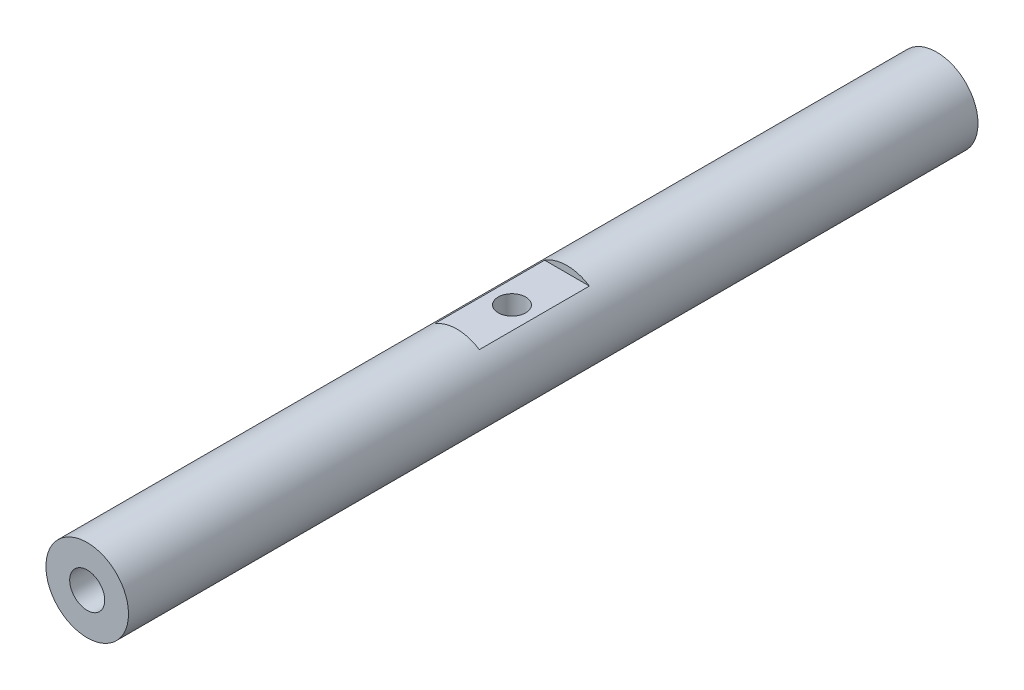
ISO-10303-21;
HEADER;
FILE_DESCRIPTION(('STEP AP214'),'2;1');
FILE_NAME('part.step','',(''),(''),'','','');
FILE_SCHEMA(('AUTOMOTIVE_DESIGN { 1 0 10303 214 1 1 1 1 }'));
ENDSEC;
DATA;
#1=APPLICATION_CONTEXT('core data for automotive mechanical design processes');
#2=APPLICATION_PROTOCOL_DEFINITION('international standard','automotive_design',2000,#1);
#3=PRODUCT_CONTEXT('',#1,'mechanical');
#4=PRODUCT('Part','Part','',(#3));
#5=PRODUCT_RELATED_PRODUCT_CATEGORY('part','',(#4));
#6=PRODUCT_DEFINITION_FORMATION('','',#4);
#7=PRODUCT_DEFINITION_CONTEXT('part definition',#1,'design');
#8=PRODUCT_DEFINITION('design','',#6,#7);
#9=PRODUCT_DEFINITION_SHAPE('','',#8);
#10=(LENGTH_UNIT() NAMED_UNIT(*) SI_UNIT(.MILLI.,.METRE.));
#11=(NAMED_UNIT(*) PLANE_ANGLE_UNIT() SI_UNIT($,.RADIAN.));
#12=(NAMED_UNIT(*) SI_UNIT($,.STERADIAN.) SOLID_ANGLE_UNIT());
#13=UNCERTAINTY_MEASURE_WITH_UNIT(LENGTH_MEASURE(1.E-05),#10,'distance_accuracy_value','');
#14=(GEOMETRIC_REPRESENTATION_CONTEXT(3) GLOBAL_UNCERTAINTY_ASSIGNED_CONTEXT((#13)) GLOBAL_UNIT_ASSIGNED_CONTEXT((#10,
#11,#12)) REPRESENTATION_CONTEXT('',''));
#15=CARTESIAN_POINT('',(0.,0.,0.));
#16=DIRECTION('',(0.,0.,1.));
#17=DIRECTION('',(1.,0.,0.));
#18=AXIS2_PLACEMENT_3D('',#15,#16,#17);
#19=CARTESIAN_POINT('',(0.,0.,49.000000044));
#20=DIRECTION('',(0.,0.,-1.));
#21=DIRECTION('',(-1.,0.,0.));
#22=AXIS2_PLACEMENT_3D('',#19,#20,#21);
#23=CYLINDRICAL_SURFACE('',#22,4.7625);
#24=DIRECTION('',(0.,0.,-1.));
#25=VECTOR('',#24,1.);
#26=CARTESIAN_POINT('',(-2.58406772357073,4.0005,49.000000044));
#27=LINE('',#26,#25);
#28=CARTESIAN_POINT('',(-2.58406772357073,4.0005,-6.35));
#29=VERTEX_POINT('',#28);
#30=CARTESIAN_POINT('',(-2.58406772357073,4.0005,6.35));
#31=VERTEX_POINT('',#30);
#32=EDGE_CURVE('E126',#29,#31,#27,.F.);
#33=ORIENTED_EDGE('',*,*,#32,.F.);
#34=CARTESIAN_POINT('',(0.,0.,-6.35));
#35=DIRECTION('',(0.,0.,-1.));
#36=DIRECTION('',(-1.,0.,0.));
#37=AXIS2_PLACEMENT_3D('',#34,#35,#36);
#38=CIRCLE('',#37,4.7625);
#39=CARTESIAN_POINT('',(2.58406772357073,4.0005,-6.35));
#40=VERTEX_POINT('',#39);
#41=EDGE_CURVE('E56',#29,#40,#38,.T.);
#42=ORIENTED_EDGE('',*,*,#41,.T.);
#43=DIRECTION('',(0.,0.,-1.));
#44=VECTOR('',#43,1.);
#45=CARTESIAN_POINT('',(2.58406772357073,4.0005,49.000000044));
#46=LINE('',#45,#44);
#47=CARTESIAN_POINT('',(2.58406772357073,4.0005,6.35));
#48=VERTEX_POINT('',#47);
#49=EDGE_CURVE('E128',#48,#40,#46,.T.);
#50=ORIENTED_EDGE('',*,*,#49,.F.);
#51=CARTESIAN_POINT('',(0.,0.,6.35));
#52=DIRECTION('',(0.,0.,1.));
#53=DIRECTION('',(1.,0.,0.));
#54=AXIS2_PLACEMENT_3D('',#51,#52,#53);
#55=CIRCLE('',#54,4.7625);
#56=EDGE_CURVE('E120',#48,#31,#55,.T.);
#57=ORIENTED_EDGE('',*,*,#56,.T.);
#58=EDGE_LOOP('',(#33,#42,#50,#57));
#59=FACE_BOUND('',#58,.T.);
#60=CARTESIAN_POINT('',(0.,0.,49.000000044));
#61=DIRECTION('',(0.,0.,1.));
#62=DIRECTION('',(1.,0.,0.));
#63=AXIS2_PLACEMENT_3D('',#60,#61,#62);
#64=CIRCLE('',#63,4.7625);
#65=CARTESIAN_POINT('',(4.7625,0.,49.000000044));
#66=VERTEX_POINT('',#65);
#67=EDGE_CURVE('E117',#66,#66,#64,.T.);
#68=ORIENTED_EDGE('',*,*,#67,.F.);
#69=EDGE_LOOP('',(#68));
#70=FACE_BOUND('',#69,.T.);
#71=CARTESIAN_POINT('',(0.,0.,-49.000000044));
#72=DIRECTION('',(0.,0.,1.));
#73=DIRECTION('',(1.,0.,0.));
#74=AXIS2_PLACEMENT_3D('',#71,#72,#73);
#75=CIRCLE('',#74,4.7625);
#76=CARTESIAN_POINT('',(4.7625,0.,-49.000000044));
#77=VERTEX_POINT('',#76);
#78=EDGE_CURVE('E116',#77,#77,#75,.T.);
#79=ORIENTED_EDGE('',*,*,#78,.T.);
#80=EDGE_LOOP('',(#79));
#81=FACE_BOUND('',#80,.T.);
#82=DIRECTION('',(0.,0.,-1.));
#83=VECTOR('',#82,1.);
#84=CARTESIAN_POINT('',(-2.58406772357073,-4.0005,49.000000044));
#85=LINE('',#84,#83);
#86=CARTESIAN_POINT('',(-2.58406772357073,-4.0005,6.35));
#87=VERTEX_POINT('',#86);
#88=CARTESIAN_POINT('',(-2.58406772357073,-4.0005,-6.35));
#89=VERTEX_POINT('',#88);
#90=EDGE_CURVE('E89',#87,#89,#85,.T.);
#91=ORIENTED_EDGE('',*,*,#90,.F.);
#92=CARTESIAN_POINT('',(0.,0.,6.35));
#93=DIRECTION('',(0.,0.,-1.));
#94=DIRECTION('',(-1.,0.,0.));
#95=AXIS2_PLACEMENT_3D('',#92,#93,#94);
#96=CIRCLE('',#95,4.7625);
#97=CARTESIAN_POINT('',(2.58406772357073,-4.0005,6.35));
#98=VERTEX_POINT('',#97);
#99=EDGE_CURVE('E11',#98,#87,#96,.T.);
#100=ORIENTED_EDGE('',*,*,#99,.F.);
#101=DIRECTION('',(0.,0.,-1.));
#102=VECTOR('',#101,1.);
#103=CARTESIAN_POINT('',(2.58406772357073,-4.0005,49.000000044));
#104=LINE('',#103,#102);
#105=CARTESIAN_POINT('',(2.58406772357073,-4.0005,-6.35));
#106=VERTEX_POINT('',#105);
#107=EDGE_CURVE('E90',#106,#98,#104,.F.);
#108=ORIENTED_EDGE('',*,*,#107,.F.);
#109=CARTESIAN_POINT('',(0.,0.,-6.35));
#110=DIRECTION('',(0.,0.,1.));
#111=DIRECTION('',(1.,0.,0.));
#112=AXIS2_PLACEMENT_3D('',#109,#110,#111);
#113=CIRCLE('',#112,4.7625);
#114=EDGE_CURVE('E42',#89,#106,#113,.T.);
#115=ORIENTED_EDGE('',*,*,#114,.F.);
#116=EDGE_LOOP('',(#91,#100,#108,#115));
#117=FACE_BOUND('',#116,.T.);
#118=ADVANCED_FACE('F35',(#59,#70,#81,#117),#23,.T.);
#119=CARTESIAN_POINT('',(0.,-4.7625,0.));
#120=DIRECTION('',(0.,1.,0.));
#121=DIRECTION('',(0.,0.,1.));
#122=AXIS2_PLACEMENT_3D('',#119,#120,#121);
#123=CYLINDRICAL_SURFACE('',#122,1.5875);
#124=CARTESIAN_POINT('',(0.,4.0005,0.));
#125=DIRECTION('',(0.,1.,0.));
#126=DIRECTION('',(0.,0.,1.));
#127=AXIS2_PLACEMENT_3D('',#124,#125,#126);
#128=CIRCLE('',#127,1.5875);
#129=CARTESIAN_POINT('',(0.,4.0005,1.5875));
#130=VERTEX_POINT('',#129);
#131=EDGE_CURVE('E93',#130,#130,#128,.T.);
#132=ORIENTED_EDGE('',*,*,#131,.T.);
#133=EDGE_LOOP('',(#132));
#134=FACE_BOUND('',#133,.T.);
#135=CARTESIAN_POINT('',(0.,-4.0005,0.));
#136=DIRECTION('',(0.,-1.,0.));
#137=DIRECTION('',(0.,0.,-1.));
#138=AXIS2_PLACEMENT_3D('',#135,#136,#137);
#139=CIRCLE('',#138,1.5875);
#140=CARTESIAN_POINT('',(0.,-4.0005,-1.5875));
#141=VERTEX_POINT('',#140);
#142=EDGE_CURVE('E91',#141,#141,#139,.F.);
#143=ORIENTED_EDGE('',*,*,#142,.F.);
#144=EDGE_LOOP('',(#143));
#145=FACE_BOUND('',#144,.T.);
#146=ADVANCED_FACE('F146',(#134,#145),#123,.F.);
#147=CARTESIAN_POINT('',(0.,0.,49.000000044));
#148=DIRECTION('',(0.,0.,1.));
#149=DIRECTION('',(1.,0.,0.));
#150=AXIS2_PLACEMENT_3D('',#147,#148,#149);
#151=PLANE('',#150);
#152=CARTESIAN_POINT('',(0.,0.,49.000000044));
#153=DIRECTION('',(0.,0.,1.));
#154=DIRECTION('',(1.,0.,0.));
#155=AXIS2_PLACEMENT_3D('',#152,#153,#154);
#156=CIRCLE('',#155,2.0193);
#157=CARTESIAN_POINT('',(2.0193,0.,49.000000044));
#158=VERTEX_POINT('',#157);
#159=EDGE_CURVE('E104',#158,#158,#156,.T.);
#160=ORIENTED_EDGE('',*,*,#159,.F.);
#161=EDGE_LOOP('',(#160));
#162=FACE_BOUND('',#161,.T.);
#163=ORIENTED_EDGE('',*,*,#67,.T.);
#164=EDGE_LOOP('',(#163));
#165=FACE_BOUND('',#164,.T.);
#166=ADVANCED_FACE('F151',(#162,#165),#151,.T.);
#167=CARTESIAN_POINT('',(0.,0.,-49.000000044));
#168=DIRECTION('',(0.,0.,1.));
#169=DIRECTION('',(1.,0.,0.));
#170=AXIS2_PLACEMENT_3D('',#167,#168,#169);
#171=PLANE('',#170);
#172=CARTESIAN_POINT('',(0.,0.,-49.000000044));
#173=DIRECTION('',(0.,0.,-1.));
#174=DIRECTION('',(-1.,0.,0.));
#175=AXIS2_PLACEMENT_3D('',#172,#173,#174);
#176=CIRCLE('',#175,2.0193);
#177=CARTESIAN_POINT('',(-2.0193,0.,-49.000000044));
#178=VERTEX_POINT('',#177);
#179=EDGE_CURVE('E110',#178,#178,#176,.T.);
#180=ORIENTED_EDGE('',*,*,#179,.F.);
#181=EDGE_LOOP('',(#180));
#182=FACE_BOUND('',#181,.T.);
#183=ORIENTED_EDGE('',*,*,#78,.F.);
#184=EDGE_LOOP('',(#183));
#185=FACE_BOUND('',#184,.T.);
#186=ADVANCED_FACE('F159',(#182,#185),#171,.F.);
#187=CARTESIAN_POINT('',(0.,0.,-36.970560044));
#188=DIRECTION('',(0.,0.,-1.));
#189=DIRECTION('',(-1.,0.,0.));
#190=AXIS2_PLACEMENT_3D('',#187,#188,#189);
#191=CONICAL_SURFACE('',#190,2.0193,1.02974425867665);
#192=CARTESIAN_POINT('',(0.,0.,-35.7572421959976));
#193=VERTEX_POINT('',#192);
#194=VERTEX_LOOP('',#193);
#195=FACE_BOUND('',#194,.T.);
#196=CARTESIAN_POINT('',(0.,0.,-36.970560044));
#197=DIRECTION('',(0.,0.,-1.));
#198=DIRECTION('',(-1.,0.,0.));
#199=AXIS2_PLACEMENT_3D('',#196,#197,#198);
#200=CIRCLE('',#199,2.0193);
#201=CARTESIAN_POINT('',(-2.0193,0.,-36.970560044));
#202=VERTEX_POINT('',#201);
#203=EDGE_CURVE('E113',#202,#202,#200,.T.);
#204=ORIENTED_EDGE('',*,*,#203,.T.);
#205=EDGE_LOOP('',(#204));
#206=FACE_BOUND('',#205,.T.);
#207=ADVANCED_FACE('F161',(#195,#206),#191,.F.);
#208=CARTESIAN_POINT('',(0.,0.,-49.000000044));
#209=DIRECTION('',(0.,0.,-1.));
#210=DIRECTION('',(-1.,0.,0.));
#211=AXIS2_PLACEMENT_3D('',#208,#209,#210);
#212=CYLINDRICAL_SURFACE('',#211,2.0193);
#213=ORIENTED_EDGE('',*,*,#203,.F.);
#214=EDGE_LOOP('',(#213));
#215=FACE_BOUND('',#214,.T.);
#216=ORIENTED_EDGE('',*,*,#179,.T.);
#217=EDGE_LOOP('',(#216));
#218=FACE_BOUND('',#217,.T.);
#219=ADVANCED_FACE('F167',(#215,#218),#212,.F.);
#220=CARTESIAN_POINT('',(0.,0.,36.970560044));
#221=DIRECTION('',(0.,0.,1.));
#222=DIRECTION('',(1.,0.,0.));
#223=AXIS2_PLACEMENT_3D('',#220,#221,#222);
#224=CONICAL_SURFACE('',#223,2.0193,1.02974425867665);
#225=CARTESIAN_POINT('',(0.,0.,35.7572421959976));
#226=VERTEX_POINT('',#225);
#227=VERTEX_LOOP('',#226);
#228=FACE_BOUND('',#227,.T.);
#229=CARTESIAN_POINT('',(0.,0.,36.970560044));
#230=DIRECTION('',(0.,0.,1.));
#231=DIRECTION('',(1.,0.,0.));
#232=AXIS2_PLACEMENT_3D('',#229,#230,#231);
#233=CIRCLE('',#232,2.0193);
#234=CARTESIAN_POINT('',(2.0193,0.,36.970560044));
#235=VERTEX_POINT('',#234);
#236=EDGE_CURVE('E107',#235,#235,#233,.T.);
#237=ORIENTED_EDGE('',*,*,#236,.T.);
#238=EDGE_LOOP('',(#237));
#239=FACE_BOUND('',#238,.T.);
#240=ADVANCED_FACE('F176',(#228,#239),#224,.F.);
#241=CARTESIAN_POINT('',(0.,0.,49.000000044));
#242=DIRECTION('',(0.,0.,1.));
#243=DIRECTION('',(1.,0.,0.));
#244=AXIS2_PLACEMENT_3D('',#241,#242,#243);
#245=CYLINDRICAL_SURFACE('',#244,2.0193);
#246=ORIENTED_EDGE('',*,*,#236,.F.);
#247=EDGE_LOOP('',(#246));
#248=FACE_BOUND('',#247,.T.);
#249=ORIENTED_EDGE('',*,*,#159,.T.);
#250=EDGE_LOOP('',(#249));
#251=FACE_BOUND('',#250,.T.);
#252=ADVANCED_FACE('F180',(#248,#251),#245,.F.);
#253=CARTESIAN_POINT('',(6.35000000000001,4.0005,-6.35));
#254=DIRECTION('',(0.,0.,-1.));
#255=DIRECTION('',(-1.,0.,0.));
#256=AXIS2_PLACEMENT_3D('',#253,#254,#255);
#257=PLANE('',#256);
#258=DIRECTION('',(-1.,0.,0.));
#259=VECTOR('',#258,1.);
#260=CARTESIAN_POINT('',(6.35000000000001,4.0005,-6.35));
#261=LINE('',#260,#259);
#262=EDGE_CURVE('E102',#40,#29,#261,.T.);
#263=ORIENTED_EDGE('',*,*,#262,.F.);
#264=ORIENTED_EDGE('',*,*,#41,.F.);
#265=EDGE_LOOP('',(#263,#264));
#266=FACE_BOUND('',#265,.T.);
#267=ADVANCED_FACE('F184',(#266),#257,.F.);
#268=CARTESIAN_POINT('',(6.35000000000001,4.0005,6.35));
#269=DIRECTION('',(0.,0.,1.));
#270=DIRECTION('',(1.,0.,0.));
#271=AXIS2_PLACEMENT_3D('',#268,#269,#270);
#272=PLANE('',#271);
#273=DIRECTION('',(1.,0.,0.));
#274=VECTOR('',#273,1.);
#275=CARTESIAN_POINT('',(6.35000000000001,4.0005,6.35));
#276=LINE('',#275,#274);
#277=EDGE_CURVE('E96',#31,#48,#276,.T.);
#278=ORIENTED_EDGE('',*,*,#277,.F.);
#279=ORIENTED_EDGE('',*,*,#56,.F.);
#280=EDGE_LOOP('',(#278,#279));
#281=FACE_BOUND('',#280,.T.);
#282=ADVANCED_FACE('F186',(#281),#272,.F.);
#283=CARTESIAN_POINT('',(0.,4.0005,0.));
#284=DIRECTION('',(0.,1.,0.));
#285=DIRECTION('',(0.,0.,1.));
#286=AXIS2_PLACEMENT_3D('',#283,#284,#285);
#287=PLANE('',#286);
#288=ORIENTED_EDGE('',*,*,#131,.F.);
#289=EDGE_LOOP('',(#288));
#290=FACE_BOUND('',#289,.T.);
#291=ORIENTED_EDGE('',*,*,#49,.T.);
#292=ORIENTED_EDGE('',*,*,#262,.T.);
#293=ORIENTED_EDGE('',*,*,#32,.T.);
#294=ORIENTED_EDGE('',*,*,#277,.T.);
#295=EDGE_LOOP('',(#291,#292,#293,#294));
#296=FACE_BOUND('',#295,.T.);
#297=ADVANCED_FACE('F142',(#290,#296),#287,.T.);
#298=CARTESIAN_POINT('',(6.35000000000001,-4.0005,6.35));
#299=DIRECTION('',(0.,0.,-1.));
#300=DIRECTION('',(-1.,0.,0.));
#301=AXIS2_PLACEMENT_3D('',#298,#299,#300);
#302=PLANE('',#301);
#303=ORIENTED_EDGE('',*,*,#99,.T.);
#304=DIRECTION('',(1.,0.,0.));
#305=VECTOR('',#304,1.);
#306=CARTESIAN_POINT('',(6.35000000000001,-4.0005,6.35));
#307=LINE('',#306,#305);
#308=EDGE_CURVE('E84',#87,#98,#307,.T.);
#309=ORIENTED_EDGE('',*,*,#308,.T.);
#310=EDGE_LOOP('',(#303,#309));
#311=FACE_BOUND('',#310,.T.);
#312=ADVANCED_FACE('F83',(#311),#302,.T.);
#313=CARTESIAN_POINT('',(6.35000000000001,-4.0005,-6.35));
#314=DIRECTION('',(0.,0.,1.));
#315=DIRECTION('',(1.,0.,0.));
#316=AXIS2_PLACEMENT_3D('',#313,#314,#315);
#317=PLANE('',#316);
#318=DIRECTION('',(-1.,0.,0.));
#319=VECTOR('',#318,1.);
#320=CARTESIAN_POINT('',(6.35000000000001,-4.0005,-6.35));
#321=LINE('',#320,#319);
#322=EDGE_CURVE('E49',#106,#89,#321,.T.);
#323=ORIENTED_EDGE('',*,*,#322,.T.);
#324=ORIENTED_EDGE('',*,*,#114,.T.);
#325=EDGE_LOOP('',(#323,#324));
#326=FACE_BOUND('',#325,.T.);
#327=ADVANCED_FACE('F132',(#326),#317,.T.);
#328=CARTESIAN_POINT('',(0.,-4.0005,0.));
#329=DIRECTION('',(0.,-1.,0.));
#330=DIRECTION('',(0.,0.,1.));
#331=AXIS2_PLACEMENT_3D('',#328,#329,#330);
#332=PLANE('',#331);
#333=ORIENTED_EDGE('',*,*,#142,.T.);
#334=EDGE_LOOP('',(#333));
#335=FACE_BOUND('',#334,.T.);
#336=ORIENTED_EDGE('',*,*,#90,.T.);
#337=ORIENTED_EDGE('',*,*,#322,.F.);
#338=ORIENTED_EDGE('',*,*,#107,.T.);
#339=ORIENTED_EDGE('',*,*,#308,.F.);
#340=EDGE_LOOP('',(#336,#337,#338,#339));
#341=FACE_BOUND('',#340,.T.);
#342=ADVANCED_FACE('F88',(#335,#341),#332,.T.);
#343=CLOSED_SHELL('',(#118,#146,#166,#186,#207,#219,#240,#252,#267,#282,#297,#312,#327,#342));
#344=MANIFOLD_SOLID_BREP('B2',#343);
#345=ADVANCED_BREP_SHAPE_REPRESENTATION('',(#18,#344),#14);
#346=SHAPE_DEFINITION_REPRESENTATION(#9,#345);
ENDSEC;
END-ISO-10303-21;
